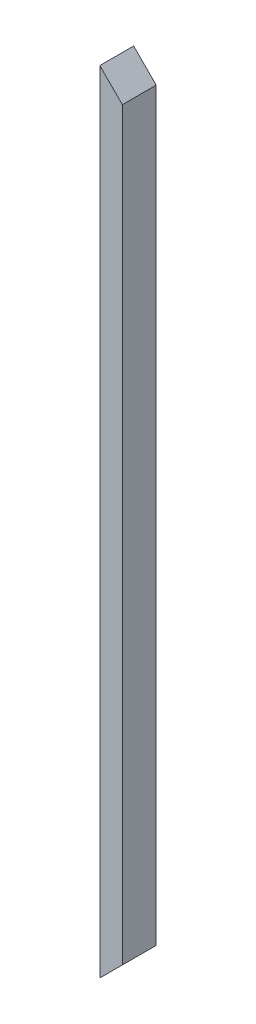
ISO-10303-21;
HEADER;
FILE_DESCRIPTION(('STEP AP214'),'2;1');
FILE_NAME('part.step','',(''),(''),'','','');
FILE_SCHEMA(('AUTOMOTIVE_DESIGN { 1 0 10303 214 1 1 1 1 }'));
ENDSEC;
DATA;
#1=APPLICATION_CONTEXT('core data for automotive mechanical design processes');
#2=APPLICATION_PROTOCOL_DEFINITION('international standard','automotive_design',2000,#1);
#3=PRODUCT_CONTEXT('',#1,'mechanical');
#4=PRODUCT('Part','Part','',(#3));
#5=PRODUCT_RELATED_PRODUCT_CATEGORY('part','',(#4));
#6=PRODUCT_DEFINITION_FORMATION('','',#4);
#7=PRODUCT_DEFINITION_CONTEXT('part definition',#1,'design');
#8=PRODUCT_DEFINITION('design','',#6,#7);
#9=PRODUCT_DEFINITION_SHAPE('','',#8);
#10=(LENGTH_UNIT() NAMED_UNIT(*) SI_UNIT(.MILLI.,.METRE.));
#11=(NAMED_UNIT(*) PLANE_ANGLE_UNIT() SI_UNIT($,.RADIAN.));
#12=(NAMED_UNIT(*) SI_UNIT($,.STERADIAN.) SOLID_ANGLE_UNIT());
#13=UNCERTAINTY_MEASURE_WITH_UNIT(LENGTH_MEASURE(1.E-05),#10,'distance_accuracy_value','');
#14=(GEOMETRIC_REPRESENTATION_CONTEXT(3) GLOBAL_UNCERTAINTY_ASSIGNED_CONTEXT((#13)) GLOBAL_UNIT_ASSIGNED_CONTEXT((#10,
#11,#12)) REPRESENTATION_CONTEXT('',''));
#15=CARTESIAN_POINT('',(0.,0.,0.));
#16=DIRECTION('',(0.,0.,1.));
#17=DIRECTION('',(1.,0.,0.));
#18=AXIS2_PLACEMENT_3D('',#15,#16,#17);
#19=CARTESIAN_POINT('',(-330.,330.,30.));
#20=DIRECTION('',(-0.70710678118655,-0.707106781186545,0.));
#21=DIRECTION('',(0.707106781186545,-0.70710678118655,0.));
#22=AXIS2_PLACEMENT_3D('',#19,#20,#21);
#23=PLANE('',#22);
#24=DIRECTION('',(-0.707106781186545,0.70710678118655,0.));
#25=VECTOR('',#24,1.);
#26=CARTESIAN_POINT('',(-330.,330.,0.));
#27=LINE('',#26,#25);
#28=CARTESIAN_POINT('',(-330.,330.,0.));
#29=VERTEX_POINT('',#28);
#30=CARTESIAN_POINT('',(-350.,350.,0.));
#31=VERTEX_POINT('',#30);
#32=EDGE_CURVE('E96',#29,#31,#27,.T.);
#33=ORIENTED_EDGE('',*,*,#32,.T.);
#34=DIRECTION('',(0.,0.,-1.));
#35=VECTOR('',#34,1.);
#36=CARTESIAN_POINT('',(-350.,350.,30.));
#37=LINE('',#36,#35);
#38=CARTESIAN_POINT('',(-350.,350.,30.));
#39=VERTEX_POINT('',#38);
#40=EDGE_CURVE('E11',#39,#31,#37,.T.);
#41=ORIENTED_EDGE('',*,*,#40,.F.);
#42=DIRECTION('',(-0.707106781186545,0.70710678118655,0.));
#43=VECTOR('',#42,1.);
#44=CARTESIAN_POINT('',(-330.,330.,30.));
#45=LINE('',#44,#43);
#46=CARTESIAN_POINT('',(-330.,330.,30.));
#47=VERTEX_POINT('',#46);
#48=EDGE_CURVE('E84',#47,#39,#45,.T.);
#49=ORIENTED_EDGE('',*,*,#48,.F.);
#50=DIRECTION('',(0.,0.,-1.));
#51=VECTOR('',#50,1.);
#52=CARTESIAN_POINT('',(-330.,330.,30.));
#53=LINE('',#52,#51);
#54=EDGE_CURVE('E92',#47,#29,#53,.T.);
#55=ORIENTED_EDGE('',*,*,#54,.T.);
#56=EDGE_LOOP('',(#33,#41,#49,#55));
#57=FACE_BOUND('',#56,.T.);
#58=ADVANCED_FACE('F33',(#57),#23,.F.);
#59=CARTESIAN_POINT('',(-350.,350.,30.));
#60=DIRECTION('',(1.,0.,0.));
#61=DIRECTION('',(0.,0.,-1.));
#62=AXIS2_PLACEMENT_3D('',#59,#60,#61);
#63=PLANE('',#62);
#64=DIRECTION('',(0.,-1.,0.));
#65=VECTOR('',#64,1.);
#66=CARTESIAN_POINT('',(-350.,350.,0.));
#67=LINE('',#66,#65);
#68=CARTESIAN_POINT('',(-350.,-350.,0.));
#69=VERTEX_POINT('',#68);
#70=EDGE_CURVE('E88',#31,#69,#67,.T.);
#71=ORIENTED_EDGE('',*,*,#70,.T.);
#72=DIRECTION('',(0.,0.,-1.));
#73=VECTOR('',#72,1.);
#74=CARTESIAN_POINT('',(-350.,-350.,30.));
#75=LINE('',#74,#73);
#76=CARTESIAN_POINT('',(-350.,-350.,30.));
#77=VERTEX_POINT('',#76);
#78=EDGE_CURVE('E41',#77,#69,#75,.T.);
#79=ORIENTED_EDGE('',*,*,#78,.F.);
#80=DIRECTION('',(0.,-1.,0.));
#81=VECTOR('',#80,1.);
#82=CARTESIAN_POINT('',(-350.,350.,30.));
#83=LINE('',#82,#81);
#84=EDGE_CURVE('E79',#39,#77,#83,.T.);
#85=ORIENTED_EDGE('',*,*,#84,.F.);
#86=ORIENTED_EDGE('',*,*,#40,.T.);
#87=EDGE_LOOP('',(#71,#79,#85,#86));
#88=FACE_BOUND('',#87,.T.);
#89=ADVANCED_FACE('F87',(#88),#63,.F.);
#90=CARTESIAN_POINT('',(-350.,-350.,30.));
#91=DIRECTION('',(-0.707106781186551,0.707106781186544,0.));
#92=DIRECTION('',(-0.707106781186544,-0.707106781186551,0.));
#93=AXIS2_PLACEMENT_3D('',#90,#91,#92);
#94=PLANE('',#93);
#95=DIRECTION('',(0.707106781186544,0.707106781186551,0.));
#96=VECTOR('',#95,1.);
#97=CARTESIAN_POINT('',(-350.,-350.,0.));
#98=LINE('',#97,#96);
#99=CARTESIAN_POINT('',(-330.,-330.,0.));
#100=VERTEX_POINT('',#99);
#101=EDGE_CURVE('E66',#69,#100,#98,.T.);
#102=ORIENTED_EDGE('',*,*,#101,.T.);
#103=DIRECTION('',(0.,0.,-1.));
#104=VECTOR('',#103,1.);
#105=CARTESIAN_POINT('',(-330.,-330.,30.));
#106=LINE('',#105,#104);
#107=CARTESIAN_POINT('',(-330.,-330.,30.));
#108=VERTEX_POINT('',#107);
#109=EDGE_CURVE('E89',#108,#100,#106,.T.);
#110=ORIENTED_EDGE('',*,*,#109,.F.);
#111=DIRECTION('',(0.707106781186544,0.707106781186551,0.));
#112=VECTOR('',#111,1.);
#113=CARTESIAN_POINT('',(-350.,-350.,30.));
#114=LINE('',#113,#112);
#115=EDGE_CURVE('E82',#77,#108,#114,.T.);
#116=ORIENTED_EDGE('',*,*,#115,.F.);
#117=ORIENTED_EDGE('',*,*,#78,.T.);
#118=EDGE_LOOP('',(#102,#110,#116,#117));
#119=FACE_BOUND('',#118,.T.);
#120=ADVANCED_FACE('F90',(#119),#94,.F.);
#121=CARTESIAN_POINT('',(-330.,-330.,30.));
#122=DIRECTION('',(-1.,0.,0.));
#123=DIRECTION('',(0.,0.,1.));
#124=AXIS2_PLACEMENT_3D('',#121,#122,#123);
#125=PLANE('',#124);
#126=DIRECTION('',(0.,1.,0.));
#127=VECTOR('',#126,1.);
#128=CARTESIAN_POINT('',(-330.,-330.,0.));
#129=LINE('',#128,#127);
#130=EDGE_CURVE('E72',#100,#29,#129,.T.);
#131=ORIENTED_EDGE('',*,*,#130,.T.);
#132=ORIENTED_EDGE('',*,*,#54,.F.);
#133=DIRECTION('',(0.,1.,0.));
#134=VECTOR('',#133,1.);
#135=CARTESIAN_POINT('',(-330.,-330.,30.));
#136=LINE('',#135,#134);
#137=EDGE_CURVE('E49',#108,#47,#136,.T.);
#138=ORIENTED_EDGE('',*,*,#137,.F.);
#139=ORIENTED_EDGE('',*,*,#109,.T.);
#140=EDGE_LOOP('',(#131,#132,#138,#139));
#141=FACE_BOUND('',#140,.T.);
#142=ADVANCED_FACE('F103',(#141),#125,.F.);
#143=CARTESIAN_POINT('',(0.,0.,30.));
#144=DIRECTION('',(0.,0.,-1.));
#145=DIRECTION('',(-1.,0.,0.));
#146=AXIS2_PLACEMENT_3D('',#143,#144,#145);
#147=PLANE('',#146);
#148=ORIENTED_EDGE('',*,*,#48,.T.);
#149=ORIENTED_EDGE('',*,*,#84,.T.);
#150=ORIENTED_EDGE('',*,*,#115,.T.);
#151=ORIENTED_EDGE('',*,*,#137,.T.);
#152=EDGE_LOOP('',(#148,#149,#150,#151));
#153=FACE_BOUND('',#152,.T.);
#154=ADVANCED_FACE('F80',(#153),#147,.F.);
#155=CARTESIAN_POINT('',(0.,0.,0.));
#156=DIRECTION('',(0.,0.,-1.));
#157=DIRECTION('',(-1.,0.,0.));
#158=AXIS2_PLACEMENT_3D('',#155,#156,#157);
#159=PLANE('',#158);
#160=ORIENTED_EDGE('',*,*,#32,.F.);
#161=ORIENTED_EDGE('',*,*,#130,.F.);
#162=ORIENTED_EDGE('',*,*,#101,.F.);
#163=ORIENTED_EDGE('',*,*,#70,.F.);
#164=EDGE_LOOP('',(#160,#161,#162,#163));
#165=FACE_BOUND('',#164,.T.);
#166=ADVANCED_FACE('F106',(#165),#159,.T.);
#167=CLOSED_SHELL('',(#58,#89,#120,#142,#154,#166));
#168=MANIFOLD_SOLID_BREP('B2',#167);
#169=ADVANCED_BREP_SHAPE_REPRESENTATION('',(#18,#168),#14);
#170=SHAPE_DEFINITION_REPRESENTATION(#9,#169);
ENDSEC;
END-ISO-10303-21;
